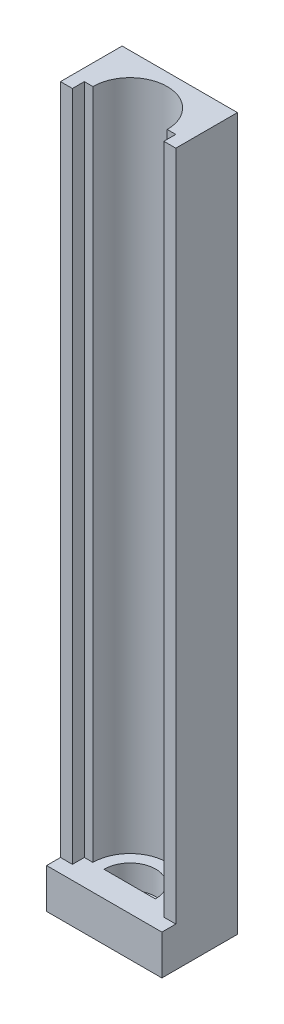
ISO-10303-21;
HEADER;
FILE_DESCRIPTION(('STEP AP214'),'2;1');
FILE_NAME('part.step','',(''),(''),'','','');
FILE_SCHEMA(('AUTOMOTIVE_DESIGN { 1 0 10303 214 1 1 1 1 }'));
ENDSEC;
DATA;
#1=APPLICATION_CONTEXT('core data for automotive mechanical design processes');
#2=APPLICATION_PROTOCOL_DEFINITION('international standard','automotive_design',2000,#1);
#3=PRODUCT_CONTEXT('',#1,'mechanical');
#4=PRODUCT('Part','Part','',(#3));
#5=PRODUCT_RELATED_PRODUCT_CATEGORY('part','',(#4));
#6=PRODUCT_DEFINITION_FORMATION('','',#4);
#7=PRODUCT_DEFINITION_CONTEXT('part definition',#1,'design');
#8=PRODUCT_DEFINITION('design','',#6,#7);
#9=PRODUCT_DEFINITION_SHAPE('','',#8);
#10=(LENGTH_UNIT() NAMED_UNIT(*) SI_UNIT(.MILLI.,.METRE.));
#11=(NAMED_UNIT(*) PLANE_ANGLE_UNIT() SI_UNIT($,.RADIAN.));
#12=(NAMED_UNIT(*) SI_UNIT($,.STERADIAN.) SOLID_ANGLE_UNIT());
#13=UNCERTAINTY_MEASURE_WITH_UNIT(LENGTH_MEASURE(1.E-05),#10,'distance_accuracy_value','');
#14=(GEOMETRIC_REPRESENTATION_CONTEXT(3) GLOBAL_UNCERTAINTY_ASSIGNED_CONTEXT((#13)) GLOBAL_UNIT_ASSIGNED_CONTEXT((#10,
#11,#12)) REPRESENTATION_CONTEXT('',''));
#15=CARTESIAN_POINT('',(0.,0.,0.));
#16=DIRECTION('',(0.,0.,1.));
#17=DIRECTION('',(1.,0.,0.));
#18=AXIS2_PLACEMENT_3D('',#15,#16,#17);
#19=CARTESIAN_POINT('',(3.,169.,0.));
#20=DIRECTION('',(0.,0.,-1.));
#21=DIRECTION('',(-1.,0.,0.));
#22=AXIS2_PLACEMENT_3D('',#19,#20,#21);
#23=PLANE('',#22);
#24=DIRECTION('',(0.,-1.,0.));
#25=VECTOR('',#24,1.);
#26=CARTESIAN_POINT('',(5.15,170.,0.));
#27=LINE('',#26,#25);
#28=CARTESIAN_POINT('',(5.15,169.,0.));
#29=VERTEX_POINT('',#28);
#30=CARTESIAN_POINT('',(5.15,0.,0.));
#31=VERTEX_POINT('',#30);
#32=EDGE_CURVE('E11',#29,#31,#27,.T.);
#33=ORIENTED_EDGE('',*,*,#32,.F.);
#34=DIRECTION('',(1.,0.,0.));
#35=VECTOR('',#34,1.);
#36=CARTESIAN_POINT('',(3.,169.,0.));
#37=LINE('',#36,#35);
#38=CARTESIAN_POINT('',(3.,169.,0.));
#39=VERTEX_POINT('',#38);
#40=EDGE_CURVE('E36',#39,#29,#37,.T.);
#41=ORIENTED_EDGE('',*,*,#40,.F.);
#42=DIRECTION('',(0.,-1.,0.));
#43=VECTOR('',#42,1.);
#44=CARTESIAN_POINT('',(3.,169.,0.));
#45=LINE('',#44,#43);
#46=CARTESIAN_POINT('',(3.,0.,0.));
#47=VERTEX_POINT('',#46);
#48=EDGE_CURVE('E185',#39,#47,#45,.T.);
#49=ORIENTED_EDGE('',*,*,#48,.T.);
#50=DIRECTION('',(1.,0.,0.));
#51=VECTOR('',#50,1.);
#52=CARTESIAN_POINT('',(3.,0.,0.));
#53=LINE('',#52,#51);
#54=EDGE_CURVE('E226',#47,#31,#53,.T.);
#55=ORIENTED_EDGE('',*,*,#54,.T.);
#56=EDGE_LOOP('',(#33,#41,#49,#55));
#57=FACE_BOUND('',#56,.T.);
#58=ADVANCED_FACE('F33',(#57),#23,.F.);
#59=DIRECTION('',(0.,-1.,0.));
#60=VECTOR('',#59,1.);
#61=CARTESIAN_POINT('',(23.85,170.,0.));
#62=LINE('',#61,#60);
#63=CARTESIAN_POINT('',(23.85,169.,0.));
#64=VERTEX_POINT('',#63);
#65=CARTESIAN_POINT('',(23.85,0.,0.));
#66=VERTEX_POINT('',#65);
#67=EDGE_CURVE('E224',#64,#66,#62,.T.);
#68=ORIENTED_EDGE('',*,*,#67,.T.);
#69=CARTESIAN_POINT('',(26.,0.,0.));
#70=VERTEX_POINT('',#69);
#71=EDGE_CURVE('E225',#66,#70,#53,.T.);
#72=ORIENTED_EDGE('',*,*,#71,.T.);
#73=DIRECTION('',(0.,-1.,0.));
#74=VECTOR('',#73,1.);
#75=CARTESIAN_POINT('',(26.,169.,0.));
#76=LINE('',#75,#74);
#77=CARTESIAN_POINT('',(26.,169.,0.));
#78=VERTEX_POINT('',#77);
#79=EDGE_CURVE('E260',#78,#70,#76,.T.);
#80=ORIENTED_EDGE('',*,*,#79,.F.);
#81=EDGE_CURVE('E240',#64,#78,#37,.T.);
#82=ORIENTED_EDGE('',*,*,#81,.F.);
#83=EDGE_LOOP('',(#68,#72,#80,#82));
#84=FACE_BOUND('',#83,.T.);
#85=ADVANCED_FACE('F294',(#84),#23,.F.);
#86=CARTESIAN_POINT('',(0.,0.,0.));
#87=DIRECTION('',(0.,1.,0.));
#88=DIRECTION('',(0.,0.,1.));
#89=AXIS2_PLACEMENT_3D('',#86,#87,#88);
#90=PLANE('',#89);
#91=DIRECTION('',(-1.,0.,0.));
#92=VECTOR('',#91,1.);
#93=CARTESIAN_POINT('',(0.,0.,0.099999999999999));
#94=LINE('',#93,#92);
#95=CARTESIAN_POINT('',(20.9492247596126,0.,0.099999999999999));
#96=VERTEX_POINT('',#95);
#97=CARTESIAN_POINT('',(8.05077524038742,0.,0.099999999999999));
#98=VERTEX_POINT('',#97);
#99=EDGE_CURVE('E216',#96,#98,#94,.T.);
#100=ORIENTED_EDGE('',*,*,#99,.T.);
#101=CARTESIAN_POINT('',(14.5,0.,0.));
#102=DIRECTION('',(0.,1.,0.));
#103=DIRECTION('',(0.,0.,1.));
#104=AXIS2_PLACEMENT_3D('',#101,#102,#103);
#105=CIRCLE('',#104,6.45);
#106=EDGE_CURVE('E67',#96,#98,#105,.T.);
#107=ORIENTED_EDGE('',*,*,#106,.F.);
#108=EDGE_LOOP('',(#100,#107));
#109=FACE_BOUND('',#108,.T.);
#110=CARTESIAN_POINT('',(14.5,0.,0.));
#111=DIRECTION('',(0.,1.,0.));
#112=DIRECTION('',(0.,0.,1.));
#113=AXIS2_PLACEMENT_3D('',#110,#111,#112);
#114=CIRCLE('',#113,9.35);
#115=EDGE_CURVE('E42',#66,#31,#114,.T.);
#116=ORIENTED_EDGE('',*,*,#115,.T.);
#117=ORIENTED_EDGE('',*,*,#54,.F.);
#118=DIRECTION('',(0.,0.,-1.));
#119=VECTOR('',#118,1.);
#120=CARTESIAN_POINT('',(3.,0.,0.));
#121=LINE('',#120,#119);
#122=CARTESIAN_POINT('',(3.,0.,3.));
#123=VERTEX_POINT('',#122);
#124=EDGE_CURVE('E181',#123,#47,#121,.T.);
#125=ORIENTED_EDGE('',*,*,#124,.F.);
#126=DIRECTION('',(1.,0.,0.));
#127=VECTOR('',#126,1.);
#128=CARTESIAN_POINT('',(0.,0.,3.));
#129=LINE('',#128,#127);
#130=CARTESIAN_POINT('',(0.,0.,3.));
#131=VERTEX_POINT('',#130);
#132=EDGE_CURVE('E177',#131,#123,#129,.T.);
#133=ORIENTED_EDGE('',*,*,#132,.F.);
#134=DIRECTION('',(0.,0.,-1.));
#135=VECTOR('',#134,1.);
#136=CARTESIAN_POINT('',(0.,0.,-12.5));
#137=LINE('',#136,#135);
#138=CARTESIAN_POINT('',(0.,0.,6.5));
#139=VERTEX_POINT('',#138);
#140=EDGE_CURVE('E199',#139,#131,#137,.T.);
#141=ORIENTED_EDGE('',*,*,#140,.F.);
#142=DIRECTION('',(-1.,0.,0.));
#143=VECTOR('',#142,1.);
#144=CARTESIAN_POINT('',(0.,0.,6.5));
#145=LINE('',#144,#143);
#146=CARTESIAN_POINT('',(29.,0.,6.5));
#147=VERTEX_POINT('',#146);
#148=EDGE_CURVE('E145',#147,#139,#145,.T.);
#149=ORIENTED_EDGE('',*,*,#148,.F.);
#150=DIRECTION('',(0.,0.,1.));
#151=VECTOR('',#150,1.);
#152=CARTESIAN_POINT('',(29.,0.,-12.5));
#153=LINE('',#152,#151);
#154=CARTESIAN_POINT('',(29.,0.,3.));
#155=VERTEX_POINT('',#154);
#156=EDGE_CURVE('E111',#155,#147,#153,.T.);
#157=ORIENTED_EDGE('',*,*,#156,.F.);
#158=DIRECTION('',(1.,0.,0.));
#159=VECTOR('',#158,1.);
#160=CARTESIAN_POINT('',(29.,0.,3.));
#161=LINE('',#160,#159);
#162=CARTESIAN_POINT('',(26.,0.,3.));
#163=VERTEX_POINT('',#162);
#164=EDGE_CURVE('E263',#163,#155,#161,.T.);
#165=ORIENTED_EDGE('',*,*,#164,.F.);
#166=DIRECTION('',(0.,0.,1.));
#167=VECTOR('',#166,1.);
#168=CARTESIAN_POINT('',(26.,0.,0.));
#169=LINE('',#168,#167);
#170=EDGE_CURVE('E180',#70,#163,#169,.T.);
#171=ORIENTED_EDGE('',*,*,#170,.F.);
#172=ORIENTED_EDGE('',*,*,#71,.F.);
#173=EDGE_LOOP('',(#116,#117,#125,#133,#141,#149,#157,#165,#171,#172));
#174=FACE_BOUND('',#173,.T.);
#175=ADVANCED_FACE('F231',(#109,#174),#90,.T.);
#176=CARTESIAN_POINT('',(0.,169.,0.));
#177=DIRECTION('',(0.,1.,0.));
#178=DIRECTION('',(0.,0.,1.));
#179=AXIS2_PLACEMENT_3D('',#176,#177,#178);
#180=PLANE('',#179);
#181=ORIENTED_EDGE('',*,*,#40,.T.);
#182=CARTESIAN_POINT('',(14.5,169.,0.));
#183=DIRECTION('',(0.,1.,0.));
#184=DIRECTION('',(0.,0.,1.));
#185=AXIS2_PLACEMENT_3D('',#182,#183,#184);
#186=CIRCLE('',#185,9.35);
#187=EDGE_CURVE('E50',#29,#64,#186,.F.);
#188=ORIENTED_EDGE('',*,*,#187,.T.);
#189=ORIENTED_EDGE('',*,*,#81,.T.);
#190=DIRECTION('',(0.,0.,1.));
#191=VECTOR('',#190,1.);
#192=CARTESIAN_POINT('',(26.,169.,0.));
#193=LINE('',#192,#191);
#194=CARTESIAN_POINT('',(26.,169.,3.));
#195=VERTEX_POINT('',#194);
#196=EDGE_CURVE('E191',#78,#195,#193,.T.);
#197=ORIENTED_EDGE('',*,*,#196,.T.);
#198=DIRECTION('',(1.,0.,0.));
#199=VECTOR('',#198,1.);
#200=CARTESIAN_POINT('',(29.,169.,3.));
#201=LINE('',#200,#199);
#202=CARTESIAN_POINT('',(29.,169.,3.));
#203=VERTEX_POINT('',#202);
#204=EDGE_CURVE('E243',#195,#203,#201,.T.);
#205=ORIENTED_EDGE('',*,*,#204,.T.);
#206=DIRECTION('',(0.,0.,-1.));
#207=VECTOR('',#206,1.);
#208=CARTESIAN_POINT('',(29.,169.,-2.5));
#209=LINE('',#208,#207);
#210=CARTESIAN_POINT('',(29.,169.,-12.5));
#211=VERTEX_POINT('',#210);
#212=EDGE_CURVE('E246',#203,#211,#209,.T.);
#213=ORIENTED_EDGE('',*,*,#212,.T.);
#214=DIRECTION('',(-1.,0.,0.));
#215=VECTOR('',#214,1.);
#216=CARTESIAN_POINT('',(0.,169.,-12.5));
#217=LINE('',#216,#215);
#218=CARTESIAN_POINT('',(0.,169.,-12.5));
#219=VERTEX_POINT('',#218);
#220=EDGE_CURVE('E195',#211,#219,#217,.T.);
#221=ORIENTED_EDGE('',*,*,#220,.T.);
#222=DIRECTION('',(0.,0.,1.));
#223=VECTOR('',#222,1.);
#224=CARTESIAN_POINT('',(0.,169.,0.));
#225=LINE('',#224,#223);
#226=CARTESIAN_POINT('',(0.,169.,3.));
#227=VERTEX_POINT('',#226);
#228=EDGE_CURVE('E151',#219,#227,#225,.T.);
#229=ORIENTED_EDGE('',*,*,#228,.T.);
#230=DIRECTION('',(1.,0.,0.));
#231=VECTOR('',#230,1.);
#232=CARTESIAN_POINT('',(0.,169.,3.));
#233=LINE('',#232,#231);
#234=CARTESIAN_POINT('',(3.,169.,3.));
#235=VERTEX_POINT('',#234);
#236=EDGE_CURVE('E119',#227,#235,#233,.T.);
#237=ORIENTED_EDGE('',*,*,#236,.T.);
#238=DIRECTION('',(0.,0.,-1.));
#239=VECTOR('',#238,1.);
#240=CARTESIAN_POINT('',(3.,169.,0.));
#241=LINE('',#240,#239);
#242=EDGE_CURVE('E169',#235,#39,#241,.T.);
#243=ORIENTED_EDGE('',*,*,#242,.T.);
#244=EDGE_LOOP('',(#181,#188,#189,#197,#205,#213,#221,#229,#237,#243));
#245=FACE_BOUND('',#244,.T.);
#246=ADVANCED_FACE('F171',(#245),#180,.T.);
#247=CARTESIAN_POINT('',(14.5,2.,0.));
#248=DIRECTION('',(0.,-1.,0.));
#249=DIRECTION('',(0.,0.,-1.));
#250=AXIS2_PLACEMENT_3D('',#247,#248,#249);
#251=CYLINDRICAL_SURFACE('',#250,6.45);
#252=DIRECTION('',(0.,-1.,0.));
#253=VECTOR('',#252,1.);
#254=CARTESIAN_POINT('',(20.9492247596126,2.,0.099999999999999));
#255=LINE('',#254,#253);
#256=CARTESIAN_POINT('',(20.9492247596126,-6.,0.099999999999999));
#257=VERTEX_POINT('',#256);
#258=EDGE_CURVE('E79',#96,#257,#255,.T.);
#259=ORIENTED_EDGE('',*,*,#258,.F.);
#260=ORIENTED_EDGE('',*,*,#106,.T.);
#261=DIRECTION('',(0.,-1.,0.));
#262=VECTOR('',#261,1.);
#263=CARTESIAN_POINT('',(8.05077524038742,2.,0.099999999999999));
#264=LINE('',#263,#262);
#265=CARTESIAN_POINT('',(8.05077524038742,-6.,0.099999999999999));
#266=VERTEX_POINT('',#265);
#267=EDGE_CURVE('E188',#98,#266,#264,.T.);
#268=ORIENTED_EDGE('',*,*,#267,.T.);
#269=CARTESIAN_POINT('',(14.5,-6.,0.));
#270=DIRECTION('',(0.,1.,0.));
#271=DIRECTION('',(0.,0.,1.));
#272=AXIS2_PLACEMENT_3D('',#269,#270,#271);
#273=CIRCLE('',#272,6.45);
#274=EDGE_CURVE('E218',#257,#266,#273,.T.);
#275=ORIENTED_EDGE('',*,*,#274,.F.);
#276=EDGE_LOOP('',(#259,#260,#268,#275));
#277=FACE_BOUND('',#276,.T.);
#278=ADVANCED_FACE('F280',(#277),#251,.F.);
#279=CARTESIAN_POINT('',(0.,169.,3.));
#280=DIRECTION('',(0.,0.,-1.));
#281=DIRECTION('',(-1.,0.,0.));
#282=AXIS2_PLACEMENT_3D('',#279,#280,#281);
#283=PLANE('',#282);
#284=ORIENTED_EDGE('',*,*,#132,.T.);
#285=DIRECTION('',(0.,-1.,0.));
#286=VECTOR('',#285,1.);
#287=CARTESIAN_POINT('',(3.,169.,3.));
#288=LINE('',#287,#286);
#289=EDGE_CURVE('E175',#235,#123,#288,.T.);
#290=ORIENTED_EDGE('',*,*,#289,.F.);
#291=ORIENTED_EDGE('',*,*,#236,.F.);
#292=DIRECTION('',(0.,-1.,0.));
#293=VECTOR('',#292,1.);
#294=CARTESIAN_POINT('',(0.,169.,3.));
#295=LINE('',#294,#293);
#296=EDGE_CURVE('E251',#227,#131,#295,.T.);
#297=ORIENTED_EDGE('',*,*,#296,.T.);
#298=EDGE_LOOP('',(#284,#290,#291,#297));
#299=FACE_BOUND('',#298,.T.);
#300=ADVANCED_FACE('F176',(#299),#283,.F.);
#301=CARTESIAN_POINT('',(3.,169.,0.));
#302=DIRECTION('',(-1.,0.,0.));
#303=DIRECTION('',(0.,0.,1.));
#304=AXIS2_PLACEMENT_3D('',#301,#302,#303);
#305=PLANE('',#304);
#306=ORIENTED_EDGE('',*,*,#124,.T.);
#307=ORIENTED_EDGE('',*,*,#48,.F.);
#308=ORIENTED_EDGE('',*,*,#242,.F.);
#309=ORIENTED_EDGE('',*,*,#289,.T.);
#310=EDGE_LOOP('',(#306,#307,#308,#309));
#311=FACE_BOUND('',#310,.T.);
#312=ADVANCED_FACE('F183',(#311),#305,.F.);
#313=CARTESIAN_POINT('',(26.,169.,0.));
#314=DIRECTION('',(1.,0.,0.));
#315=DIRECTION('',(0.,0.,-1.));
#316=AXIS2_PLACEMENT_3D('',#313,#314,#315);
#317=PLANE('',#316);
#318=ORIENTED_EDGE('',*,*,#170,.T.);
#319=DIRECTION('',(0.,-1.,0.));
#320=VECTOR('',#319,1.);
#321=CARTESIAN_POINT('',(26.,169.,3.));
#322=LINE('',#321,#320);
#323=EDGE_CURVE('E264',#195,#163,#322,.T.);
#324=ORIENTED_EDGE('',*,*,#323,.F.);
#325=ORIENTED_EDGE('',*,*,#196,.F.);
#326=ORIENTED_EDGE('',*,*,#79,.T.);
#327=EDGE_LOOP('',(#318,#324,#325,#326));
#328=FACE_BOUND('',#327,.T.);
#329=ADVANCED_FACE('F304',(#328),#317,.F.);
#330=CARTESIAN_POINT('',(29.,169.,3.));
#331=DIRECTION('',(0.,0.,-1.));
#332=DIRECTION('',(-1.,0.,0.));
#333=AXIS2_PLACEMENT_3D('',#330,#331,#332);
#334=PLANE('',#333);
#335=ORIENTED_EDGE('',*,*,#164,.T.);
#336=DIRECTION('',(0.,-1.,0.));
#337=VECTOR('',#336,1.);
#338=CARTESIAN_POINT('',(29.,169.,3.));
#339=LINE('',#338,#337);
#340=EDGE_CURVE('E198',#203,#155,#339,.T.);
#341=ORIENTED_EDGE('',*,*,#340,.F.);
#342=ORIENTED_EDGE('',*,*,#204,.F.);
#343=ORIENTED_EDGE('',*,*,#323,.T.);
#344=EDGE_LOOP('',(#335,#341,#342,#343));
#345=FACE_BOUND('',#344,.T.);
#346=ADVANCED_FACE('F306',(#345),#334,.F.);
#347=CARTESIAN_POINT('',(29.,169.,-2.5));
#348=DIRECTION('',(-1.,0.,0.));
#349=DIRECTION('',(0.,0.,1.));
#350=AXIS2_PLACEMENT_3D('',#347,#348,#349);
#351=PLANE('',#350);
#352=ORIENTED_EDGE('',*,*,#340,.T.);
#353=ORIENTED_EDGE('',*,*,#156,.T.);
#354=DIRECTION('',(0.,1.,0.));
#355=VECTOR('',#354,1.);
#356=CARTESIAN_POINT('',(29.,-10.,6.5));
#357=LINE('',#356,#355);
#358=CARTESIAN_POINT('',(29.,-10.,6.5));
#359=VERTEX_POINT('',#358);
#360=EDGE_CURVE('E214',#359,#147,#357,.T.);
#361=ORIENTED_EDGE('',*,*,#360,.F.);
#362=DIRECTION('',(0.,0.,1.));
#363=VECTOR('',#362,1.);
#364=CARTESIAN_POINT('',(29.,-10.,-12.5));
#365=LINE('',#364,#363);
#366=CARTESIAN_POINT('',(29.,-10.,-12.5));
#367=VERTEX_POINT('',#366);
#368=EDGE_CURVE('E208',#367,#359,#365,.T.);
#369=ORIENTED_EDGE('',*,*,#368,.F.);
#370=DIRECTION('',(0.,-1.,0.));
#371=VECTOR('',#370,1.);
#372=CARTESIAN_POINT('',(29.,169.,-12.5));
#373=LINE('',#372,#371);
#374=EDGE_CURVE('E101',#211,#367,#373,.T.);
#375=ORIENTED_EDGE('',*,*,#374,.F.);
#376=ORIENTED_EDGE('',*,*,#212,.F.);
#377=EDGE_LOOP('',(#352,#353,#361,#369,#375,#376));
#378=FACE_BOUND('',#377,.T.);
#379=ADVANCED_FACE('F308',(#378),#351,.F.);
#380=CARTESIAN_POINT('',(0.,169.,-12.5));
#381=DIRECTION('',(0.,0.,1.));
#382=DIRECTION('',(1.,0.,0.));
#383=AXIS2_PLACEMENT_3D('',#380,#381,#382);
#384=PLANE('',#383);
#385=ORIENTED_EDGE('',*,*,#374,.T.);
#386=DIRECTION('',(1.,0.,0.));
#387=VECTOR('',#386,1.);
#388=CARTESIAN_POINT('',(0.,-10.,-12.5));
#389=LINE('',#388,#387);
#390=CARTESIAN_POINT('',(0.,-10.,-12.5));
#391=VERTEX_POINT('',#390);
#392=EDGE_CURVE('E210',#391,#367,#389,.T.);
#393=ORIENTED_EDGE('',*,*,#392,.F.);
#394=DIRECTION('',(0.,-1.,0.));
#395=VECTOR('',#394,1.);
#396=CARTESIAN_POINT('',(0.,169.,-12.5));
#397=LINE('',#396,#395);
#398=EDGE_CURVE('E268',#219,#391,#397,.T.);
#399=ORIENTED_EDGE('',*,*,#398,.F.);
#400=ORIENTED_EDGE('',*,*,#220,.F.);
#401=EDGE_LOOP('',(#385,#393,#399,#400));
#402=FACE_BOUND('',#401,.T.);
#403=ADVANCED_FACE('F311',(#402),#384,.F.);
#404=CARTESIAN_POINT('',(0.,169.,0.));
#405=DIRECTION('',(1.,0.,0.));
#406=DIRECTION('',(0.,0.,-1.));
#407=AXIS2_PLACEMENT_3D('',#404,#405,#406);
#408=PLANE('',#407);
#409=ORIENTED_EDGE('',*,*,#398,.T.);
#410=DIRECTION('',(0.,0.,-1.));
#411=VECTOR('',#410,1.);
#412=CARTESIAN_POINT('',(0.,-10.,-12.5));
#413=LINE('',#412,#411);
#414=CARTESIAN_POINT('',(0.,-10.,6.5));
#415=VERTEX_POINT('',#414);
#416=EDGE_CURVE('E212',#415,#391,#413,.T.);
#417=ORIENTED_EDGE('',*,*,#416,.F.);
#418=DIRECTION('',(0.,1.,0.));
#419=VECTOR('',#418,1.);
#420=CARTESIAN_POINT('',(0.,-10.,6.5));
#421=LINE('',#420,#419);
#422=EDGE_CURVE('E270',#415,#139,#421,.T.);
#423=ORIENTED_EDGE('',*,*,#422,.T.);
#424=ORIENTED_EDGE('',*,*,#140,.T.);
#425=ORIENTED_EDGE('',*,*,#296,.F.);
#426=ORIENTED_EDGE('',*,*,#228,.F.);
#427=EDGE_LOOP('',(#409,#417,#423,#424,#425,#426));
#428=FACE_BOUND('',#427,.T.);
#429=ADVANCED_FACE('F313',(#428),#408,.F.);
#430=CARTESIAN_POINT('',(0.,-10.,6.5));
#431=DIRECTION('',(0.,0.,-1.));
#432=DIRECTION('',(-1.,0.,0.));
#433=AXIS2_PLACEMENT_3D('',#430,#431,#432);
#434=PLANE('',#433);
#435=ORIENTED_EDGE('',*,*,#148,.T.);
#436=ORIENTED_EDGE('',*,*,#422,.F.);
#437=DIRECTION('',(-1.,0.,0.));
#438=VECTOR('',#437,1.);
#439=CARTESIAN_POINT('',(0.,-10.,6.5));
#440=LINE('',#439,#438);
#441=EDGE_CURVE('E88',#359,#415,#440,.T.);
#442=ORIENTED_EDGE('',*,*,#441,.F.);
#443=ORIENTED_EDGE('',*,*,#360,.T.);
#444=EDGE_LOOP('',(#435,#436,#442,#443));
#445=FACE_BOUND('',#444,.T.);
#446=ADVANCED_FACE('F316',(#445),#434,.F.);
#447=CARTESIAN_POINT('',(0.,-10.,0.));
#448=DIRECTION('',(0.,1.,0.));
#449=DIRECTION('',(0.,0.,1.));
#450=AXIS2_PLACEMENT_3D('',#447,#448,#449);
#451=PLANE('',#450);
#452=ORIENTED_EDGE('',*,*,#416,.T.);
#453=ORIENTED_EDGE('',*,*,#392,.T.);
#454=ORIENTED_EDGE('',*,*,#368,.T.);
#455=ORIENTED_EDGE('',*,*,#441,.T.);
#456=EDGE_LOOP('',(#452,#453,#454,#455));
#457=FACE_BOUND('',#456,.T.);
#458=ADVANCED_FACE('F291',(#457),#451,.F.);
#459=CARTESIAN_POINT('',(8.05077524038742,2.,0.099999999999999));
#460=DIRECTION('',(0.,0.,-1.));
#461=DIRECTION('',(-1.,0.,0.));
#462=AXIS2_PLACEMENT_3D('',#459,#460,#461);
#463=PLANE('',#462);
#464=ORIENTED_EDGE('',*,*,#258,.T.);
#465=DIRECTION('',(1.,0.,0.));
#466=VECTOR('',#465,1.);
#467=CARTESIAN_POINT('',(8.05077524038742,-6.,0.099999999999999));
#468=LINE('',#467,#466);
#469=EDGE_CURVE('E219',#266,#257,#468,.T.);
#470=ORIENTED_EDGE('',*,*,#469,.F.);
#471=ORIENTED_EDGE('',*,*,#267,.F.);
#472=ORIENTED_EDGE('',*,*,#99,.F.);
#473=EDGE_LOOP('',(#464,#470,#471,#472));
#474=FACE_BOUND('',#473,.T.);
#475=ADVANCED_FACE('F278',(#474),#463,.T.);
#476=CARTESIAN_POINT('',(14.5,-6.,0.));
#477=DIRECTION('',(0.,1.,0.));
#478=DIRECTION('',(0.,0.,1.));
#479=AXIS2_PLACEMENT_3D('',#476,#477,#478);
#480=PLANE('',#479);
#481=ORIENTED_EDGE('',*,*,#274,.T.);
#482=ORIENTED_EDGE('',*,*,#469,.T.);
#483=EDGE_LOOP('',(#481,#482));
#484=FACE_BOUND('',#483,.T.);
#485=ADVANCED_FACE('F282',(#484),#480,.T.);
#486=CARTESIAN_POINT('',(14.5,170.,0.));
#487=DIRECTION('',(0.,-1.,0.));
#488=DIRECTION('',(0.,0.,-1.));
#489=AXIS2_PLACEMENT_3D('',#486,#487,#488);
#490=CYLINDRICAL_SURFACE('',#489,9.35);
#491=ORIENTED_EDGE('',*,*,#32,.T.);
#492=ORIENTED_EDGE('',*,*,#115,.F.);
#493=ORIENTED_EDGE('',*,*,#67,.F.);
#494=ORIENTED_EDGE('',*,*,#187,.F.);
#495=EDGE_LOOP('',(#491,#492,#493,#494));
#496=FACE_BOUND('',#495,.T.);
#497=ADVANCED_FACE('F284',(#496),#490,.F.);
#498=CLOSED_SHELL('',(#58,#85,#175,#246,#278,#300,#312,#329,#346,#379,#403,#429,#446,#458,#475,
#485,#497));
#499=MANIFOLD_SOLID_BREP('B2',#498);
#500=ADVANCED_BREP_SHAPE_REPRESENTATION('',(#18,#499),#14);
#501=SHAPE_DEFINITION_REPRESENTATION(#9,#500);
ENDSEC;
END-ISO-10303-21;
